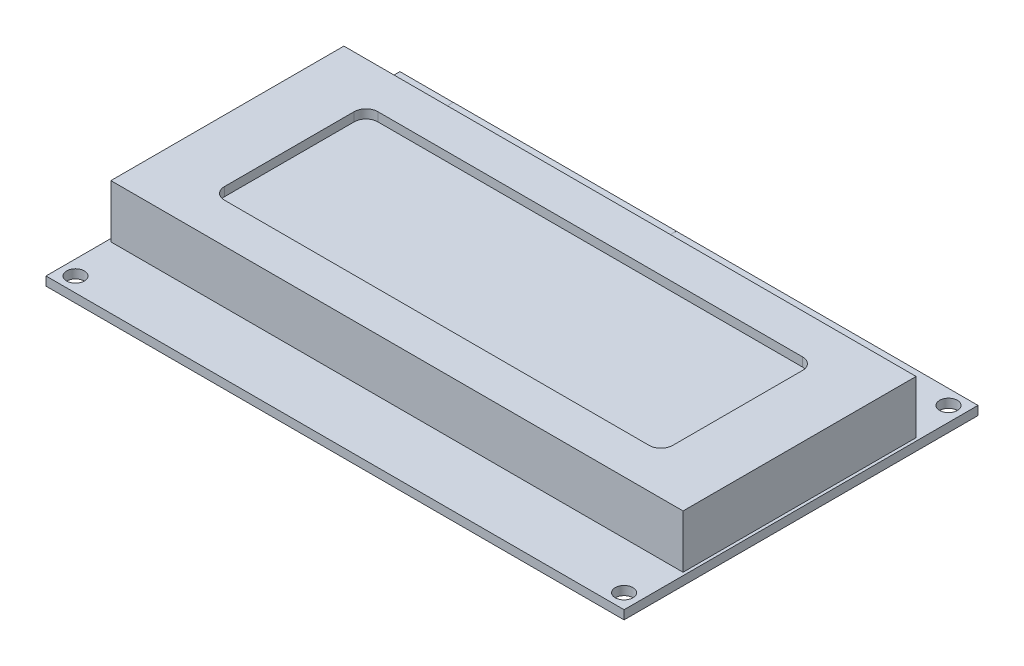
ISO-10303-21;
HEADER;
FILE_DESCRIPTION(('STEP AP214'),'2;1');
FILE_NAME('part.step','',(''),(''),'','','');
FILE_SCHEMA(('AUTOMOTIVE_DESIGN { 1 0 10303 214 1 1 1 1 }'));
ENDSEC;
DATA;
#1=APPLICATION_CONTEXT('core data for automotive mechanical design processes');
#2=APPLICATION_PROTOCOL_DEFINITION('international standard','automotive_design',2000,#1);
#3=PRODUCT_CONTEXT('',#1,'mechanical');
#4=PRODUCT('Part','Part','',(#3));
#5=PRODUCT_RELATED_PRODUCT_CATEGORY('part','',(#4));
#6=PRODUCT_DEFINITION_FORMATION('','',#4);
#7=PRODUCT_DEFINITION_CONTEXT('part definition',#1,'design');
#8=PRODUCT_DEFINITION('design','',#6,#7);
#9=PRODUCT_DEFINITION_SHAPE('','',#8);
#10=(LENGTH_UNIT() NAMED_UNIT(*) SI_UNIT(.MILLI.,.METRE.));
#11=(NAMED_UNIT(*) PLANE_ANGLE_UNIT() SI_UNIT($,.RADIAN.));
#12=(NAMED_UNIT(*) SI_UNIT($,.STERADIAN.) SOLID_ANGLE_UNIT());
#13=UNCERTAINTY_MEASURE_WITH_UNIT(LENGTH_MEASURE(1.E-05),#10,'distance_accuracy_value','');
#14=(GEOMETRIC_REPRESENTATION_CONTEXT(3) GLOBAL_UNCERTAINTY_ASSIGNED_CONTEXT((#13)) GLOBAL_UNIT_ASSIGNED_CONTEXT((#10,
#11,#12)) REPRESENTATION_CONTEXT('',''));
#15=CARTESIAN_POINT('',(0.,0.,0.));
#16=DIRECTION('',(0.,0.,1.));
#17=DIRECTION('',(1.,0.,0.));
#18=AXIS2_PLACEMENT_3D('',#15,#16,#17);
#19=CARTESIAN_POINT('',(0.,1.5,0.));
#20=DIRECTION('',(0.,1.,0.));
#21=DIRECTION('',(0.,0.,1.));
#22=AXIS2_PLACEMENT_3D('',#19,#20,#21);
#23=PLANE('',#22);
#24=DIRECTION('',(1.,0.,0.));
#25=VECTOR('',#24,1.);
#26=CARTESIAN_POINT('',(-48.5,1.5,19.5));
#27=LINE('',#26,#25);
#28=CARTESIAN_POINT('',(-48.5,1.5,19.5));
#29=VERTEX_POINT('',#28);
#30=CARTESIAN_POINT('',(48.5,1.5,19.5));
#31=VERTEX_POINT('',#30);
#32=EDGE_CURVE('E299',#29,#31,#27,.T.);
#33=ORIENTED_EDGE('',*,*,#32,.F.);
#34=DIRECTION('',(0.,0.,1.));
#35=VECTOR('',#34,1.);
#36=CARTESIAN_POINT('',(-48.5,1.5,-20.));
#37=LINE('',#36,#35);
#38=CARTESIAN_POINT('',(-48.5,1.5,-20.));
#39=VERTEX_POINT('',#38);
#40=EDGE_CURVE('E271',#39,#29,#37,.T.);
#41=ORIENTED_EDGE('',*,*,#40,.F.);
#42=DIRECTION('',(-1.,0.,0.));
#43=VECTOR('',#42,1.);
#44=CARTESIAN_POINT('',(-48.5,1.5,-20.));
#45=LINE('',#44,#43);
#46=CARTESIAN_POINT('',(48.5,1.5,-20.));
#47=VERTEX_POINT('',#46);
#48=EDGE_CURVE('E290',#47,#39,#45,.T.);
#49=ORIENTED_EDGE('',*,*,#48,.F.);
#50=DIRECTION('',(0.,0.,-1.));
#51=VECTOR('',#50,1.);
#52=CARTESIAN_POINT('',(48.5,1.5,-20.));
#53=LINE('',#52,#51);
#54=EDGE_CURVE('E301',#31,#47,#53,.T.);
#55=ORIENTED_EDGE('',*,*,#54,.F.);
#56=EDGE_LOOP('',(#33,#41,#49,#55));
#57=FACE_BOUND('',#56,.T.);
#58=CARTESIAN_POINT('',(-46.5,1.5,-27.5));
#59=DIRECTION('',(0.,1.,0.));
#60=DIRECTION('',(0.,0.,1.));
#61=AXIS2_PLACEMENT_3D('',#58,#59,#60);
#62=CIRCLE('',#61,1.5);
#63=CARTESIAN_POINT('',(-46.5,1.5,-26.));
#64=VERTEX_POINT('',#63);
#65=EDGE_CURVE('E215',#64,#64,#62,.T.);
#66=ORIENTED_EDGE('',*,*,#65,.F.);
#67=EDGE_LOOP('',(#66));
#68=FACE_BOUND('',#67,.T.);
#69=CARTESIAN_POINT('',(46.5,1.5,-27.5));
#70=DIRECTION('',(0.,1.,0.));
#71=DIRECTION('',(0.,0.,1.));
#72=AXIS2_PLACEMENT_3D('',#69,#70,#71);
#73=CIRCLE('',#72,1.5);
#74=CARTESIAN_POINT('',(46.5,1.5,-26.));
#75=VERTEX_POINT('',#74);
#76=EDGE_CURVE('E209',#75,#75,#73,.T.);
#77=ORIENTED_EDGE('',*,*,#76,.F.);
#78=EDGE_LOOP('',(#77));
#79=FACE_BOUND('',#78,.T.);
#80=CARTESIAN_POINT('',(46.5,1.5,27.5));
#81=DIRECTION('',(0.,1.,0.));
#82=DIRECTION('',(0.,0.,1.));
#83=AXIS2_PLACEMENT_3D('',#80,#81,#82);
#84=CIRCLE('',#83,1.5);
#85=CARTESIAN_POINT('',(46.5,1.5,29.));
#86=VERTEX_POINT('',#85);
#87=EDGE_CURVE('E203',#86,#86,#84,.T.);
#88=ORIENTED_EDGE('',*,*,#87,.F.);
#89=EDGE_LOOP('',(#88));
#90=FACE_BOUND('',#89,.T.);
#91=CARTESIAN_POINT('',(-46.5,1.5,27.5));
#92=DIRECTION('',(0.,1.,0.));
#93=DIRECTION('',(0.,0.,1.));
#94=AXIS2_PLACEMENT_3D('',#91,#92,#93);
#95=CIRCLE('',#94,1.5);
#96=CARTESIAN_POINT('',(-46.5,1.5,29.));
#97=VERTEX_POINT('',#96);
#98=EDGE_CURVE('E192',#97,#97,#95,.T.);
#99=ORIENTED_EDGE('',*,*,#98,.F.);
#100=EDGE_LOOP('',(#99));
#101=FACE_BOUND('',#100,.T.);
#102=DIRECTION('',(1.,0.,0.));
#103=VECTOR('',#102,1.);
#104=CARTESIAN_POINT('',(-39.9546214681868,1.5,-25.4744230837432));
#105=LINE('',#104,#103);
#106=CARTESIAN_POINT('',(-39.9546214681868,1.5,-25.4744230837432));
#107=VERTEX_POINT('',#106);
#108=CARTESIAN_POINT('',(-2.14521457547312,1.5,-25.4744230837432));
#109=VERTEX_POINT('',#108);
#110=EDGE_CURVE('E49',#107,#109,#105,.T.);
#111=ORIENTED_EDGE('',*,*,#110,.F.);
#112=DIRECTION('',(0.,0.,1.));
#113=VECTOR('',#112,1.);
#114=CARTESIAN_POINT('',(-39.9546214681868,1.5,-30.));
#115=LINE('',#114,#113);
#116=CARTESIAN_POINT('',(-39.9546214681868,1.5,-30.));
#117=VERTEX_POINT('',#116);
#118=EDGE_CURVE('E191',#117,#107,#115,.T.);
#119=ORIENTED_EDGE('',*,*,#118,.F.);
#120=DIRECTION('',(-1.,0.,0.));
#121=VECTOR('',#120,1.);
#122=CARTESIAN_POINT('',(-49.,1.5,-30.));
#123=LINE('',#122,#121);
#124=CARTESIAN_POINT('',(-49.,1.5,-30.));
#125=VERTEX_POINT('',#124);
#126=EDGE_CURVE('E323',#117,#125,#123,.T.);
#127=ORIENTED_EDGE('',*,*,#126,.T.);
#128=DIRECTION('',(0.,0.,1.));
#129=VECTOR('',#128,1.);
#130=CARTESIAN_POINT('',(-49.,1.5,-30.));
#131=LINE('',#130,#129);
#132=CARTESIAN_POINT('',(-49.,1.5,30.));
#133=VERTEX_POINT('',#132);
#134=EDGE_CURVE('E315',#125,#133,#131,.T.);
#135=ORIENTED_EDGE('',*,*,#134,.T.);
#136=DIRECTION('',(1.,0.,0.));
#137=VECTOR('',#136,1.);
#138=CARTESIAN_POINT('',(-49.,1.5,30.));
#139=LINE('',#138,#137);
#140=CARTESIAN_POINT('',(49.,1.5,30.));
#141=VERTEX_POINT('',#140);
#142=EDGE_CURVE('E318',#133,#141,#139,.T.);
#143=ORIENTED_EDGE('',*,*,#142,.T.);
#144=DIRECTION('',(0.,0.,-1.));
#145=VECTOR('',#144,1.);
#146=CARTESIAN_POINT('',(49.,1.5,-30.));
#147=LINE('',#146,#145);
#148=CARTESIAN_POINT('',(49.,1.5,-30.));
#149=VERTEX_POINT('',#148);
#150=EDGE_CURVE('E321',#141,#149,#147,.T.);
#151=ORIENTED_EDGE('',*,*,#150,.T.);
#152=CARTESIAN_POINT('',(-2.14521457547312,1.5,-30.));
#153=VERTEX_POINT('',#152);
#154=EDGE_CURVE('E324',#149,#153,#123,.T.);
#155=ORIENTED_EDGE('',*,*,#154,.T.);
#156=DIRECTION('',(0.,0.,-1.));
#157=VECTOR('',#156,1.);
#158=CARTESIAN_POINT('',(-2.14521457547312,1.5,-30.));
#159=LINE('',#158,#157);
#160=EDGE_CURVE('E54',#109,#153,#159,.T.);
#161=ORIENTED_EDGE('',*,*,#160,.F.);
#162=EDGE_LOOP('',(#111,#119,#127,#135,#143,#151,#155,#161));
#163=FACE_BOUND('',#162,.T.);
#164=ADVANCED_FACE('F34',(#57,#68,#79,#90,#101,#163),#23,.T.);
#165=CARTESIAN_POINT('',(-49.,1.5,-30.));
#166=DIRECTION('',(1.,0.,0.));
#167=DIRECTION('',(0.,0.,-1.));
#168=AXIS2_PLACEMENT_3D('',#165,#166,#167);
#169=PLANE('',#168);
#170=DIRECTION('',(0.,0.,1.));
#171=VECTOR('',#170,1.);
#172=CARTESIAN_POINT('',(-49.,0.,-30.));
#173=LINE('',#172,#171);
#174=CARTESIAN_POINT('',(-49.,0.,-30.));
#175=VERTEX_POINT('',#174);
#176=CARTESIAN_POINT('',(-49.,0.,30.));
#177=VERTEX_POINT('',#176);
#178=EDGE_CURVE('E314',#175,#177,#173,.T.);
#179=ORIENTED_EDGE('',*,*,#178,.T.);
#180=DIRECTION('',(0.,-1.,0.));
#181=VECTOR('',#180,1.);
#182=CARTESIAN_POINT('',(-49.,1.5,30.));
#183=LINE('',#182,#181);
#184=EDGE_CURVE('E11',#133,#177,#183,.T.);
#185=ORIENTED_EDGE('',*,*,#184,.F.);
#186=ORIENTED_EDGE('',*,*,#134,.F.);
#187=DIRECTION('',(0.,-1.,0.));
#188=VECTOR('',#187,1.);
#189=CARTESIAN_POINT('',(-49.,1.5,-30.));
#190=LINE('',#189,#188);
#191=EDGE_CURVE('E326',#125,#175,#190,.T.);
#192=ORIENTED_EDGE('',*,*,#191,.T.);
#193=EDGE_LOOP('',(#179,#185,#186,#192));
#194=FACE_BOUND('',#193,.T.);
#195=ADVANCED_FACE('F36',(#194),#169,.F.);
#196=CARTESIAN_POINT('',(-49.,1.5,30.));
#197=DIRECTION('',(0.,0.,-1.));
#198=DIRECTION('',(-1.,0.,0.));
#199=AXIS2_PLACEMENT_3D('',#196,#197,#198);
#200=PLANE('',#199);
#201=DIRECTION('',(1.,0.,0.));
#202=VECTOR('',#201,1.);
#203=CARTESIAN_POINT('',(-49.,0.,30.));
#204=LINE('',#203,#202);
#205=CARTESIAN_POINT('',(49.,0.,30.));
#206=VERTEX_POINT('',#205);
#207=EDGE_CURVE('E329',#177,#206,#204,.T.);
#208=ORIENTED_EDGE('',*,*,#207,.T.);
#209=DIRECTION('',(0.,-1.,0.));
#210=VECTOR('',#209,1.);
#211=CARTESIAN_POINT('',(49.,1.5,30.));
#212=LINE('',#211,#210);
#213=EDGE_CURVE('E42',#141,#206,#212,.T.);
#214=ORIENTED_EDGE('',*,*,#213,.F.);
#215=ORIENTED_EDGE('',*,*,#142,.F.);
#216=ORIENTED_EDGE('',*,*,#184,.T.);
#217=EDGE_LOOP('',(#208,#214,#215,#216));
#218=FACE_BOUND('',#217,.T.);
#219=ADVANCED_FACE('F382',(#218),#200,.F.);
#220=CARTESIAN_POINT('',(49.,1.5,-30.));
#221=DIRECTION('',(-1.,0.,0.));
#222=DIRECTION('',(0.,0.,1.));
#223=AXIS2_PLACEMENT_3D('',#220,#221,#222);
#224=PLANE('',#223);
#225=DIRECTION('',(0.,0.,-1.));
#226=VECTOR('',#225,1.);
#227=CARTESIAN_POINT('',(49.,0.,-30.));
#228=LINE('',#227,#226);
#229=CARTESIAN_POINT('',(49.,0.,-30.));
#230=VERTEX_POINT('',#229);
#231=EDGE_CURVE('E331',#206,#230,#228,.T.);
#232=ORIENTED_EDGE('',*,*,#231,.T.);
#233=DIRECTION('',(0.,-1.,0.));
#234=VECTOR('',#233,1.);
#235=CARTESIAN_POINT('',(49.,1.5,-30.));
#236=LINE('',#235,#234);
#237=EDGE_CURVE('E336',#149,#230,#236,.T.);
#238=ORIENTED_EDGE('',*,*,#237,.F.);
#239=ORIENTED_EDGE('',*,*,#150,.F.);
#240=ORIENTED_EDGE('',*,*,#213,.T.);
#241=EDGE_LOOP('',(#232,#238,#239,#240));
#242=FACE_BOUND('',#241,.T.);
#243=ADVANCED_FACE('F343',(#242),#224,.F.);
#244=CARTESIAN_POINT('',(-49.,1.5,-30.));
#245=DIRECTION('',(0.,0.,1.));
#246=DIRECTION('',(1.,0.,0.));
#247=AXIS2_PLACEMENT_3D('',#244,#245,#246);
#248=PLANE('',#247);
#249=DIRECTION('',(-1.,0.,0.));
#250=VECTOR('',#249,1.);
#251=CARTESIAN_POINT('',(-49.,0.,-30.));
#252=LINE('',#251,#250);
#253=EDGE_CURVE('E319',#230,#175,#252,.T.);
#254=ORIENTED_EDGE('',*,*,#253,.T.);
#255=ORIENTED_EDGE('',*,*,#191,.F.);
#256=ORIENTED_EDGE('',*,*,#126,.F.);
#257=DIRECTION('',(0.,-1.,0.));
#258=VECTOR('',#257,1.);
#259=CARTESIAN_POINT('',(-39.9546214681868,1.51,-30.));
#260=LINE('',#259,#258);
#261=CARTESIAN_POINT('',(-39.9546214681868,1.51,-30.));
#262=VERTEX_POINT('',#261);
#263=EDGE_CURVE('E357',#262,#117,#260,.T.);
#264=ORIENTED_EDGE('',*,*,#263,.F.);
#265=DIRECTION('',(-1.,0.,0.));
#266=VECTOR('',#265,1.);
#267=CARTESIAN_POINT('',(-39.9546214681868,1.51,-30.));
#268=LINE('',#267,#266);
#269=CARTESIAN_POINT('',(-2.14521457547312,1.51,-30.));
#270=VERTEX_POINT('',#269);
#271=EDGE_CURVE('E185',#270,#262,#268,.T.);
#272=ORIENTED_EDGE('',*,*,#271,.F.);
#273=DIRECTION('',(0.,-1.,0.));
#274=VECTOR('',#273,1.);
#275=CARTESIAN_POINT('',(-2.14521457547312,1.51,-30.));
#276=LINE('',#275,#274);
#277=EDGE_CURVE('E197',#270,#153,#276,.T.);
#278=ORIENTED_EDGE('',*,*,#277,.T.);
#279=ORIENTED_EDGE('',*,*,#154,.F.);
#280=ORIENTED_EDGE('',*,*,#237,.T.);
#281=EDGE_LOOP('',(#254,#255,#256,#264,#272,#278,#279,#280));
#282=FACE_BOUND('',#281,.T.);
#283=ADVANCED_FACE('F352',(#282),#248,.F.);
#284=CARTESIAN_POINT('',(0.,0.,0.));
#285=DIRECTION('',(0.,1.,0.));
#286=DIRECTION('',(0.,0.,1.));
#287=AXIS2_PLACEMENT_3D('',#284,#285,#286);
#288=PLANE('',#287);
#289=CARTESIAN_POINT('',(-46.5,0.,27.5));
#290=DIRECTION('',(0.,1.,0.));
#291=DIRECTION('',(0.,0.,1.));
#292=AXIS2_PLACEMENT_3D('',#289,#290,#291);
#293=CIRCLE('',#292,1.5);
#294=CARTESIAN_POINT('',(-46.5,0.,29.));
#295=VERTEX_POINT('',#294);
#296=EDGE_CURVE('E195',#295,#295,#293,.F.);
#297=ORIENTED_EDGE('',*,*,#296,.F.);
#298=EDGE_LOOP('',(#297));
#299=FACE_BOUND('',#298,.T.);
#300=CARTESIAN_POINT('',(46.5,0.,27.5));
#301=DIRECTION('',(0.,1.,0.));
#302=DIRECTION('',(0.,0.,1.));
#303=AXIS2_PLACEMENT_3D('',#300,#301,#302);
#304=CIRCLE('',#303,1.5);
#305=CARTESIAN_POINT('',(46.5,0.,29.));
#306=VERTEX_POINT('',#305);
#307=EDGE_CURVE('E206',#306,#306,#304,.F.);
#308=ORIENTED_EDGE('',*,*,#307,.F.);
#309=EDGE_LOOP('',(#308));
#310=FACE_BOUND('',#309,.T.);
#311=CARTESIAN_POINT('',(46.5,0.,-27.5));
#312=DIRECTION('',(0.,1.,0.));
#313=DIRECTION('',(0.,0.,1.));
#314=AXIS2_PLACEMENT_3D('',#311,#312,#313);
#315=CIRCLE('',#314,1.5);
#316=CARTESIAN_POINT('',(46.5,0.,-26.));
#317=VERTEX_POINT('',#316);
#318=EDGE_CURVE('E212',#317,#317,#315,.F.);
#319=ORIENTED_EDGE('',*,*,#318,.F.);
#320=EDGE_LOOP('',(#319));
#321=FACE_BOUND('',#320,.T.);
#322=CARTESIAN_POINT('',(-46.5,0.,-27.5));
#323=DIRECTION('',(0.,1.,0.));
#324=DIRECTION('',(0.,0.,1.));
#325=AXIS2_PLACEMENT_3D('',#322,#323,#324);
#326=CIRCLE('',#325,1.5);
#327=CARTESIAN_POINT('',(-46.5,0.,-26.));
#328=VERTEX_POINT('',#327);
#329=EDGE_CURVE('E218',#328,#328,#326,.F.);
#330=ORIENTED_EDGE('',*,*,#329,.F.);
#331=EDGE_LOOP('',(#330));
#332=FACE_BOUND('',#331,.T.);
#333=ORIENTED_EDGE('',*,*,#178,.F.);
#334=ORIENTED_EDGE('',*,*,#253,.F.);
#335=ORIENTED_EDGE('',*,*,#231,.F.);
#336=ORIENTED_EDGE('',*,*,#207,.F.);
#337=EDGE_LOOP('',(#333,#334,#335,#336));
#338=FACE_BOUND('',#337,.T.);
#339=ADVANCED_FACE('F349',(#299,#310,#321,#332,#338),#288,.F.);
#340=CARTESIAN_POINT('',(-48.5,10.5,-20.));
#341=DIRECTION('',(1.,0.,0.));
#342=DIRECTION('',(0.,0.,-1.));
#343=AXIS2_PLACEMENT_3D('',#340,#341,#342);
#344=PLANE('',#343);
#345=ORIENTED_EDGE('',*,*,#40,.T.);
#346=DIRECTION('',(0.,-1.,0.));
#347=VECTOR('',#346,1.);
#348=CARTESIAN_POINT('',(-48.5,10.5,19.5));
#349=LINE('',#348,#347);
#350=CARTESIAN_POINT('',(-48.5,10.5,19.5));
#351=VERTEX_POINT('',#350);
#352=EDGE_CURVE('E312',#351,#29,#349,.T.);
#353=ORIENTED_EDGE('',*,*,#352,.F.);
#354=DIRECTION('',(0.,0.,1.));
#355=VECTOR('',#354,1.);
#356=CARTESIAN_POINT('',(-48.5,10.5,-20.));
#357=LINE('',#356,#355);
#358=CARTESIAN_POINT('',(-48.5,10.5,-20.));
#359=VERTEX_POINT('',#358);
#360=EDGE_CURVE('E286',#359,#351,#357,.T.);
#361=ORIENTED_EDGE('',*,*,#360,.F.);
#362=DIRECTION('',(0.,-1.,0.));
#363=VECTOR('',#362,1.);
#364=CARTESIAN_POINT('',(-48.5,10.5,-20.));
#365=LINE('',#364,#363);
#366=EDGE_CURVE('E296',#359,#39,#365,.T.);
#367=ORIENTED_EDGE('',*,*,#366,.T.);
#368=EDGE_LOOP('',(#345,#353,#361,#367));
#369=FACE_BOUND('',#368,.T.);
#370=ADVANCED_FACE('F387',(#369),#344,.F.);
#371=CARTESIAN_POINT('',(-48.5,10.5,19.5));
#372=DIRECTION('',(0.,0.,-1.));
#373=DIRECTION('',(-1.,0.,0.));
#374=AXIS2_PLACEMENT_3D('',#371,#372,#373);
#375=PLANE('',#374);
#376=ORIENTED_EDGE('',*,*,#32,.T.);
#377=DIRECTION('',(0.,-1.,0.));
#378=VECTOR('',#377,1.);
#379=CARTESIAN_POINT('',(48.5,10.5,19.5));
#380=LINE('',#379,#378);
#381=CARTESIAN_POINT('',(48.5,10.5,19.5));
#382=VERTEX_POINT('',#381);
#383=EDGE_CURVE('E309',#382,#31,#380,.T.);
#384=ORIENTED_EDGE('',*,*,#383,.F.);
#385=DIRECTION('',(1.,0.,0.));
#386=VECTOR('',#385,1.);
#387=CARTESIAN_POINT('',(-48.5,10.5,19.5));
#388=LINE('',#387,#386);
#389=EDGE_CURVE('E289',#351,#382,#388,.T.);
#390=ORIENTED_EDGE('',*,*,#389,.F.);
#391=ORIENTED_EDGE('',*,*,#352,.T.);
#392=EDGE_LOOP('',(#376,#384,#390,#391));
#393=FACE_BOUND('',#392,.T.);
#394=ADVANCED_FACE('F421',(#393),#375,.F.);
#395=CARTESIAN_POINT('',(48.5,10.5,-20.));
#396=DIRECTION('',(-1.,0.,0.));
#397=DIRECTION('',(0.,0.,1.));
#398=AXIS2_PLACEMENT_3D('',#395,#396,#397);
#399=PLANE('',#398);
#400=ORIENTED_EDGE('',*,*,#54,.T.);
#401=DIRECTION('',(0.,-1.,0.));
#402=VECTOR('',#401,1.);
#403=CARTESIAN_POINT('',(48.5,10.5,-20.));
#404=LINE('',#403,#402);
#405=CARTESIAN_POINT('',(48.5,10.5,-20.));
#406=VERTEX_POINT('',#405);
#407=EDGE_CURVE('E307',#406,#47,#404,.T.);
#408=ORIENTED_EDGE('',*,*,#407,.F.);
#409=DIRECTION('',(0.,0.,-1.));
#410=VECTOR('',#409,1.);
#411=CARTESIAN_POINT('',(48.5,10.5,-20.));
#412=LINE('',#411,#410);
#413=EDGE_CURVE('E292',#382,#406,#412,.T.);
#414=ORIENTED_EDGE('',*,*,#413,.F.);
#415=ORIENTED_EDGE('',*,*,#383,.T.);
#416=EDGE_LOOP('',(#400,#408,#414,#415));
#417=FACE_BOUND('',#416,.T.);
#418=ADVANCED_FACE('F428',(#417),#399,.F.);
#419=CARTESIAN_POINT('',(-48.5,10.5,-20.));
#420=DIRECTION('',(0.,0.,1.));
#421=DIRECTION('',(1.,0.,0.));
#422=AXIS2_PLACEMENT_3D('',#419,#420,#421);
#423=PLANE('',#422);
#424=ORIENTED_EDGE('',*,*,#48,.T.);
#425=ORIENTED_EDGE('',*,*,#366,.F.);
#426=DIRECTION('',(-1.,0.,0.));
#427=VECTOR('',#426,1.);
#428=CARTESIAN_POINT('',(-48.5,10.5,-20.));
#429=LINE('',#428,#427);
#430=EDGE_CURVE('E294',#406,#359,#429,.T.);
#431=ORIENTED_EDGE('',*,*,#430,.F.);
#432=ORIENTED_EDGE('',*,*,#407,.T.);
#433=EDGE_LOOP('',(#424,#425,#431,#432));
#434=FACE_BOUND('',#433,.T.);
#435=ADVANCED_FACE('F435',(#434),#423,.F.);
#436=CARTESIAN_POINT('',(0.,10.5,0.));
#437=DIRECTION('',(0.,1.,0.));
#438=DIRECTION('',(0.,0.,1.));
#439=AXIS2_PLACEMENT_3D('',#436,#437,#438);
#440=PLANE('',#439);
#441=CARTESIAN_POINT('',(36.,10.5,-11.25));
#442=DIRECTION('',(0.,1.,0.));
#443=DIRECTION('',(0.,0.,-1.));
#444=AXIS2_PLACEMENT_3D('',#441,#442,#443);
#445=CIRCLE('',#444,2.);
#446=CARTESIAN_POINT('',(38.,10.5,-11.25));
#447=VERTEX_POINT('',#446);
#448=CARTESIAN_POINT('',(36.,10.5,-13.25));
#449=VERTEX_POINT('',#448);
#450=EDGE_CURVE('E221',#447,#449,#445,.T.);
#451=ORIENTED_EDGE('',*,*,#450,.F.);
#452=DIRECTION('',(0.,0.,-1.));
#453=VECTOR('',#452,1.);
#454=CARTESIAN_POINT('',(38.,10.5,-11.25));
#455=LINE('',#454,#453);
#456=CARTESIAN_POINT('',(38.,10.5,10.75));
#457=VERTEX_POINT('',#456);
#458=EDGE_CURVE('E226',#457,#447,#455,.T.);
#459=ORIENTED_EDGE('',*,*,#458,.F.);
#460=CARTESIAN_POINT('',(36.,10.5,10.75));
#461=DIRECTION('',(0.,1.,0.));
#462=DIRECTION('',(0.,0.,1.));
#463=AXIS2_PLACEMENT_3D('',#460,#461,#462);
#464=CIRCLE('',#463,2.);
#465=CARTESIAN_POINT('',(36.,10.5,12.75));
#466=VERTEX_POINT('',#465);
#467=EDGE_CURVE('E264',#466,#457,#464,.T.);
#468=ORIENTED_EDGE('',*,*,#467,.F.);
#469=DIRECTION('',(1.,0.,0.));
#470=VECTOR('',#469,1.);
#471=CARTESIAN_POINT('',(-36.,10.5,12.75));
#472=LINE('',#471,#470);
#473=CARTESIAN_POINT('',(-36.,10.5,12.75));
#474=VERTEX_POINT('',#473);
#475=EDGE_CURVE('E261',#474,#466,#472,.T.);
#476=ORIENTED_EDGE('',*,*,#475,.F.);
#477=CARTESIAN_POINT('',(-36.,10.5,10.75));
#478=DIRECTION('',(0.,1.,0.));
#479=DIRECTION('',(0.,0.,1.));
#480=AXIS2_PLACEMENT_3D('',#477,#478,#479);
#481=CIRCLE('',#480,2.);
#482=CARTESIAN_POINT('',(-38.,10.5,10.75));
#483=VERTEX_POINT('',#482);
#484=EDGE_CURVE('E258',#483,#474,#481,.T.);
#485=ORIENTED_EDGE('',*,*,#484,.F.);
#486=DIRECTION('',(0.,0.,1.));
#487=VECTOR('',#486,1.);
#488=CARTESIAN_POINT('',(-38.,10.5,-11.25));
#489=LINE('',#488,#487);
#490=CARTESIAN_POINT('',(-38.,10.5,-11.25));
#491=VERTEX_POINT('',#490);
#492=EDGE_CURVE('E255',#491,#483,#489,.T.);
#493=ORIENTED_EDGE('',*,*,#492,.F.);
#494=CARTESIAN_POINT('',(-36.,10.5,-11.25));
#495=DIRECTION('',(0.,1.,0.));
#496=DIRECTION('',(0.,0.,1.));
#497=AXIS2_PLACEMENT_3D('',#494,#495,#496);
#498=CIRCLE('',#497,2.);
#499=CARTESIAN_POINT('',(-36.,10.5,-13.25));
#500=VERTEX_POINT('',#499);
#501=EDGE_CURVE('E252',#500,#491,#498,.T.);
#502=ORIENTED_EDGE('',*,*,#501,.F.);
#503=DIRECTION('',(-1.,0.,0.));
#504=VECTOR('',#503,1.);
#505=CARTESIAN_POINT('',(-36.,10.5,-13.25));
#506=LINE('',#505,#504);
#507=EDGE_CURVE('E249',#449,#500,#506,.T.);
#508=ORIENTED_EDGE('',*,*,#507,.F.);
#509=EDGE_LOOP('',(#451,#459,#468,#476,#485,#493,#502,#508));
#510=FACE_BOUND('',#509,.T.);
#511=ORIENTED_EDGE('',*,*,#360,.T.);
#512=ORIENTED_EDGE('',*,*,#389,.T.);
#513=ORIENTED_EDGE('',*,*,#413,.T.);
#514=ORIENTED_EDGE('',*,*,#430,.T.);
#515=EDGE_LOOP('',(#511,#512,#513,#514));
#516=FACE_BOUND('',#515,.T.);
#517=ADVANCED_FACE('F443',(#510,#516),#440,.T.);
#518=CARTESIAN_POINT('',(36.,9.,-11.25));
#519=DIRECTION('',(0.,1.,0.));
#520=DIRECTION('',(0.,0.,1.));
#521=AXIS2_PLACEMENT_3D('',#518,#519,#520);
#522=CYLINDRICAL_SURFACE('',#521,2.);
#523=ORIENTED_EDGE('',*,*,#450,.T.);
#524=DIRECTION('',(0.,1.,0.));
#525=VECTOR('',#524,1.);
#526=CARTESIAN_POINT('',(36.,9.,-13.25));
#527=LINE('',#526,#525);
#528=CARTESIAN_POINT('',(36.,9.,-13.25));
#529=VERTEX_POINT('',#528);
#530=EDGE_CURVE('E247',#529,#449,#527,.T.);
#531=ORIENTED_EDGE('',*,*,#530,.F.);
#532=CARTESIAN_POINT('',(36.,9.,-11.25));
#533=DIRECTION('',(0.,1.,0.));
#534=DIRECTION('',(0.,0.,-1.));
#535=AXIS2_PLACEMENT_3D('',#532,#533,#534);
#536=CIRCLE('',#535,2.);
#537=CARTESIAN_POINT('',(38.,9.,-11.25));
#538=VERTEX_POINT('',#537);
#539=EDGE_CURVE('E222',#538,#529,#536,.T.);
#540=ORIENTED_EDGE('',*,*,#539,.F.);
#541=DIRECTION('',(0.,1.,0.));
#542=VECTOR('',#541,1.);
#543=CARTESIAN_POINT('',(38.,9.,-11.25));
#544=LINE('',#543,#542);
#545=EDGE_CURVE('E269',#538,#447,#544,.T.);
#546=ORIENTED_EDGE('',*,*,#545,.T.);
#547=EDGE_LOOP('',(#523,#531,#540,#546));
#548=FACE_BOUND('',#547,.T.);
#549=ADVANCED_FACE('F451',(#548),#522,.F.);
#550=CARTESIAN_POINT('',(38.,9.,-11.25));
#551=DIRECTION('',(1.,0.,0.));
#552=DIRECTION('',(0.,0.,-1.));
#553=AXIS2_PLACEMENT_3D('',#550,#551,#552);
#554=PLANE('',#553);
#555=ORIENTED_EDGE('',*,*,#458,.T.);
#556=ORIENTED_EDGE('',*,*,#545,.F.);
#557=DIRECTION('',(0.,0.,-1.));
#558=VECTOR('',#557,1.);
#559=CARTESIAN_POINT('',(38.,9.,-11.25));
#560=LINE('',#559,#558);
#561=CARTESIAN_POINT('',(38.,9.,10.75));
#562=VERTEX_POINT('',#561);
#563=EDGE_CURVE('E244',#562,#538,#560,.T.);
#564=ORIENTED_EDGE('',*,*,#563,.F.);
#565=DIRECTION('',(0.,1.,0.));
#566=VECTOR('',#565,1.);
#567=CARTESIAN_POINT('',(38.,9.,10.75));
#568=LINE('',#567,#566);
#569=EDGE_CURVE('E272',#562,#457,#568,.T.);
#570=ORIENTED_EDGE('',*,*,#569,.T.);
#571=EDGE_LOOP('',(#555,#556,#564,#570));
#572=FACE_BOUND('',#571,.T.);
#573=ADVANCED_FACE('F459',(#572),#554,.F.);
#574=CARTESIAN_POINT('',(36.,9.,10.75));
#575=DIRECTION('',(0.,1.,0.));
#576=DIRECTION('',(0.,0.,1.));
#577=AXIS2_PLACEMENT_3D('',#574,#575,#576);
#578=CYLINDRICAL_SURFACE('',#577,2.);
#579=ORIENTED_EDGE('',*,*,#467,.T.);
#580=ORIENTED_EDGE('',*,*,#569,.F.);
#581=CARTESIAN_POINT('',(36.,9.,10.75));
#582=DIRECTION('',(0.,1.,0.));
#583=DIRECTION('',(0.,0.,1.));
#584=AXIS2_PLACEMENT_3D('',#581,#582,#583);
#585=CIRCLE('',#584,2.);
#586=CARTESIAN_POINT('',(36.,9.,12.75));
#587=VERTEX_POINT('',#586);
#588=EDGE_CURVE('E241',#587,#562,#585,.T.);
#589=ORIENTED_EDGE('',*,*,#588,.F.);
#590=DIRECTION('',(0.,1.,0.));
#591=VECTOR('',#590,1.);
#592=CARTESIAN_POINT('',(36.,9.,12.75));
#593=LINE('',#592,#591);
#594=EDGE_CURVE('E274',#587,#466,#593,.T.);
#595=ORIENTED_EDGE('',*,*,#594,.T.);
#596=EDGE_LOOP('',(#579,#580,#589,#595));
#597=FACE_BOUND('',#596,.T.);
#598=ADVANCED_FACE('F467',(#597),#578,.F.);
#599=CARTESIAN_POINT('',(-36.,9.,12.75));
#600=DIRECTION('',(0.,0.,1.));
#601=DIRECTION('',(1.,0.,0.));
#602=AXIS2_PLACEMENT_3D('',#599,#600,#601);
#603=PLANE('',#602);
#604=ORIENTED_EDGE('',*,*,#475,.T.);
#605=ORIENTED_EDGE('',*,*,#594,.F.);
#606=DIRECTION('',(1.,0.,0.));
#607=VECTOR('',#606,1.);
#608=CARTESIAN_POINT('',(-36.,9.,12.75));
#609=LINE('',#608,#607);
#610=CARTESIAN_POINT('',(-36.,9.,12.75));
#611=VERTEX_POINT('',#610);
#612=EDGE_CURVE('E238',#611,#587,#609,.T.);
#613=ORIENTED_EDGE('',*,*,#612,.F.);
#614=DIRECTION('',(0.,1.,0.));
#615=VECTOR('',#614,1.);
#616=CARTESIAN_POINT('',(-36.,9.,12.75));
#617=LINE('',#616,#615);
#618=EDGE_CURVE('E276',#611,#474,#617,.T.);
#619=ORIENTED_EDGE('',*,*,#618,.T.);
#620=EDGE_LOOP('',(#604,#605,#613,#619));
#621=FACE_BOUND('',#620,.T.);
#622=ADVANCED_FACE('F475',(#621),#603,.F.);
#623=CARTESIAN_POINT('',(-36.,9.,10.75));
#624=DIRECTION('',(0.,1.,0.));
#625=DIRECTION('',(0.,0.,1.));
#626=AXIS2_PLACEMENT_3D('',#623,#624,#625);
#627=CYLINDRICAL_SURFACE('',#626,2.);
#628=ORIENTED_EDGE('',*,*,#484,.T.);
#629=ORIENTED_EDGE('',*,*,#618,.F.);
#630=CARTESIAN_POINT('',(-36.,9.,10.75));
#631=DIRECTION('',(0.,1.,0.));
#632=DIRECTION('',(0.,0.,1.));
#633=AXIS2_PLACEMENT_3D('',#630,#631,#632);
#634=CIRCLE('',#633,2.);
#635=CARTESIAN_POINT('',(-38.,9.,10.75));
#636=VERTEX_POINT('',#635);
#637=EDGE_CURVE('E235',#636,#611,#634,.T.);
#638=ORIENTED_EDGE('',*,*,#637,.F.);
#639=DIRECTION('',(0.,1.,0.));
#640=VECTOR('',#639,1.);
#641=CARTESIAN_POINT('',(-38.,9.,10.75));
#642=LINE('',#641,#640);
#643=EDGE_CURVE('E278',#636,#483,#642,.T.);
#644=ORIENTED_EDGE('',*,*,#643,.T.);
#645=EDGE_LOOP('',(#628,#629,#638,#644));
#646=FACE_BOUND('',#645,.T.);
#647=ADVANCED_FACE('F483',(#646),#627,.F.);
#648=CARTESIAN_POINT('',(-38.,9.,-11.25));
#649=DIRECTION('',(-1.,0.,0.));
#650=DIRECTION('',(0.,0.,1.));
#651=AXIS2_PLACEMENT_3D('',#648,#649,#650);
#652=PLANE('',#651);
#653=ORIENTED_EDGE('',*,*,#492,.T.);
#654=ORIENTED_EDGE('',*,*,#643,.F.);
#655=DIRECTION('',(0.,0.,1.));
#656=VECTOR('',#655,1.);
#657=CARTESIAN_POINT('',(-38.,9.,-11.25));
#658=LINE('',#657,#656);
#659=CARTESIAN_POINT('',(-38.,9.,-11.25));
#660=VERTEX_POINT('',#659);
#661=EDGE_CURVE('E232',#660,#636,#658,.T.);
#662=ORIENTED_EDGE('',*,*,#661,.F.);
#663=DIRECTION('',(0.,1.,0.));
#664=VECTOR('',#663,1.);
#665=CARTESIAN_POINT('',(-38.,9.,-11.25));
#666=LINE('',#665,#664);
#667=EDGE_CURVE('E280',#660,#491,#666,.T.);
#668=ORIENTED_EDGE('',*,*,#667,.T.);
#669=EDGE_LOOP('',(#653,#654,#662,#668));
#670=FACE_BOUND('',#669,.T.);
#671=ADVANCED_FACE('F491',(#670),#652,.F.);
#672=CARTESIAN_POINT('',(-36.,9.,-11.25));
#673=DIRECTION('',(0.,1.,0.));
#674=DIRECTION('',(0.,0.,1.));
#675=AXIS2_PLACEMENT_3D('',#672,#673,#674);
#676=CYLINDRICAL_SURFACE('',#675,2.);
#677=ORIENTED_EDGE('',*,*,#501,.T.);
#678=ORIENTED_EDGE('',*,*,#667,.F.);
#679=CARTESIAN_POINT('',(-36.,9.,-11.25));
#680=DIRECTION('',(0.,1.,0.));
#681=DIRECTION('',(0.,0.,1.));
#682=AXIS2_PLACEMENT_3D('',#679,#680,#681);
#683=CIRCLE('',#682,2.);
#684=CARTESIAN_POINT('',(-36.,9.,-13.25));
#685=VERTEX_POINT('',#684);
#686=EDGE_CURVE('E229',#685,#660,#683,.T.);
#687=ORIENTED_EDGE('',*,*,#686,.F.);
#688=DIRECTION('',(0.,1.,0.));
#689=VECTOR('',#688,1.);
#690=CARTESIAN_POINT('',(-36.,9.,-13.25));
#691=LINE('',#690,#689);
#692=EDGE_CURVE('E282',#685,#500,#691,.T.);
#693=ORIENTED_EDGE('',*,*,#692,.T.);
#694=EDGE_LOOP('',(#677,#678,#687,#693));
#695=FACE_BOUND('',#694,.T.);
#696=ADVANCED_FACE('F499',(#695),#676,.F.);
#697=CARTESIAN_POINT('',(-36.,9.,-13.25));
#698=DIRECTION('',(0.,0.,-1.));
#699=DIRECTION('',(-1.,0.,0.));
#700=AXIS2_PLACEMENT_3D('',#697,#698,#699);
#701=PLANE('',#700);
#702=ORIENTED_EDGE('',*,*,#507,.T.);
#703=ORIENTED_EDGE('',*,*,#692,.F.);
#704=DIRECTION('',(-1.,0.,0.));
#705=VECTOR('',#704,1.);
#706=CARTESIAN_POINT('',(-36.,9.,-13.25));
#707=LINE('',#706,#705);
#708=EDGE_CURVE('E225',#529,#685,#707,.T.);
#709=ORIENTED_EDGE('',*,*,#708,.F.);
#710=ORIENTED_EDGE('',*,*,#530,.T.);
#711=EDGE_LOOP('',(#702,#703,#709,#710));
#712=FACE_BOUND('',#711,.T.);
#713=ADVANCED_FACE('F507',(#712),#701,.F.);
#714=CARTESIAN_POINT('',(36.,9.,-11.25));
#715=DIRECTION('',(0.,-1.,0.));
#716=DIRECTION('',(0.,0.,-1.));
#717=AXIS2_PLACEMENT_3D('',#714,#715,#716);
#718=PLANE('',#717);
#719=ORIENTED_EDGE('',*,*,#539,.T.);
#720=ORIENTED_EDGE('',*,*,#708,.T.);
#721=ORIENTED_EDGE('',*,*,#686,.T.);
#722=ORIENTED_EDGE('',*,*,#661,.T.);
#723=ORIENTED_EDGE('',*,*,#637,.T.);
#724=ORIENTED_EDGE('',*,*,#612,.T.);
#725=ORIENTED_EDGE('',*,*,#588,.T.);
#726=ORIENTED_EDGE('',*,*,#563,.T.);
#727=EDGE_LOOP('',(#719,#720,#721,#722,#723,#724,#725,#726));
#728=FACE_BOUND('',#727,.T.);
#729=ADVANCED_FACE('F515',(#728),#718,.F.);
#730=CARTESIAN_POINT('',(-46.5,-0.000999999999999916,-27.5));
#731=DIRECTION('',(0.,1.,0.));
#732=DIRECTION('',(0.,0.,1.));
#733=AXIS2_PLACEMENT_3D('',#730,#731,#732);
#734=CYLINDRICAL_SURFACE('',#733,1.5);
#735=ORIENTED_EDGE('',*,*,#65,.T.);
#736=EDGE_LOOP('',(#735));
#737=FACE_BOUND('',#736,.T.);
#738=ORIENTED_EDGE('',*,*,#329,.T.);
#739=EDGE_LOOP('',(#738));
#740=FACE_BOUND('',#739,.T.);
#741=ADVANCED_FACE('F523',(#737,#740),#734,.F.);
#742=CARTESIAN_POINT('',(46.5,-0.000999999999999916,-27.5));
#743=DIRECTION('',(0.,1.,0.));
#744=DIRECTION('',(0.,0.,1.));
#745=AXIS2_PLACEMENT_3D('',#742,#743,#744);
#746=CYLINDRICAL_SURFACE('',#745,1.5);
#747=ORIENTED_EDGE('',*,*,#76,.T.);
#748=EDGE_LOOP('',(#747));
#749=FACE_BOUND('',#748,.T.);
#750=ORIENTED_EDGE('',*,*,#318,.T.);
#751=EDGE_LOOP('',(#750));
#752=FACE_BOUND('',#751,.T.);
#753=ADVANCED_FACE('F529',(#749,#752),#746,.F.);
#754=CARTESIAN_POINT('',(46.5,-0.000999999999999916,27.5));
#755=DIRECTION('',(0.,1.,0.));
#756=DIRECTION('',(0.,0.,1.));
#757=AXIS2_PLACEMENT_3D('',#754,#755,#756);
#758=CYLINDRICAL_SURFACE('',#757,1.5);
#759=ORIENTED_EDGE('',*,*,#87,.T.);
#760=EDGE_LOOP('',(#759));
#761=FACE_BOUND('',#760,.T.);
#762=ORIENTED_EDGE('',*,*,#307,.T.);
#763=EDGE_LOOP('',(#762));
#764=FACE_BOUND('',#763,.T.);
#765=ADVANCED_FACE('F537',(#761,#764),#758,.F.);
#766=CARTESIAN_POINT('',(-46.5,-0.000999999999999916,27.5));
#767=DIRECTION('',(0.,1.,0.));
#768=DIRECTION('',(0.,0.,1.));
#769=AXIS2_PLACEMENT_3D('',#766,#767,#768);
#770=CYLINDRICAL_SURFACE('',#769,1.5);
#771=ORIENTED_EDGE('',*,*,#98,.T.);
#772=EDGE_LOOP('',(#771));
#773=FACE_BOUND('',#772,.T.);
#774=ORIENTED_EDGE('',*,*,#296,.T.);
#775=EDGE_LOOP('',(#774));
#776=FACE_BOUND('',#775,.T.);
#777=ADVANCED_FACE('F545',(#773,#776),#770,.F.);
#778=CARTESIAN_POINT('',(-39.9546214681868,1.51,-30.));
#779=DIRECTION('',(1.,0.,0.));
#780=DIRECTION('',(0.,0.,-1.));
#781=AXIS2_PLACEMENT_3D('',#778,#779,#780);
#782=PLANE('',#781);
#783=ORIENTED_EDGE('',*,*,#118,.T.);
#784=DIRECTION('',(0.,-1.,0.));
#785=VECTOR('',#784,1.);
#786=CARTESIAN_POINT('',(-39.9546214681868,1.51,-25.4744230837432));
#787=LINE('',#786,#785);
#788=CARTESIAN_POINT('',(-39.9546214681868,1.51,-25.4744230837432));
#789=VERTEX_POINT('',#788);
#790=EDGE_CURVE('E173',#789,#107,#787,.T.);
#791=ORIENTED_EDGE('',*,*,#790,.F.);
#792=DIRECTION('',(0.,0.,1.));
#793=VECTOR('',#792,1.);
#794=CARTESIAN_POINT('',(-39.9546214681868,1.51,-30.));
#795=LINE('',#794,#793);
#796=EDGE_CURVE('E180',#262,#789,#795,.T.);
#797=ORIENTED_EDGE('',*,*,#796,.F.);
#798=ORIENTED_EDGE('',*,*,#263,.T.);
#799=EDGE_LOOP('',(#783,#791,#797,#798));
#800=FACE_BOUND('',#799,.T.);
#801=ADVANCED_FACE('F190',(#800),#782,.F.);
#802=CARTESIAN_POINT('',(-39.9546214681868,1.51,-25.4744230837432));
#803=DIRECTION('',(0.,0.,-1.));
#804=DIRECTION('',(-1.,0.,0.));
#805=AXIS2_PLACEMENT_3D('',#802,#803,#804);
#806=PLANE('',#805);
#807=ORIENTED_EDGE('',*,*,#110,.T.);
#808=DIRECTION('',(0.,-1.,0.));
#809=VECTOR('',#808,1.);
#810=CARTESIAN_POINT('',(-2.14521457547312,1.51,-25.4744230837432));
#811=LINE('',#810,#809);
#812=CARTESIAN_POINT('',(-2.14521457547312,1.51,-25.4744230837432));
#813=VERTEX_POINT('',#812);
#814=EDGE_CURVE('E176',#813,#109,#811,.T.);
#815=ORIENTED_EDGE('',*,*,#814,.F.);
#816=DIRECTION('',(1.,0.,0.));
#817=VECTOR('',#816,1.);
#818=CARTESIAN_POINT('',(-39.9546214681868,1.51,-25.4744230837432));
#819=LINE('',#818,#817);
#820=EDGE_CURVE('E169',#789,#813,#819,.T.);
#821=ORIENTED_EDGE('',*,*,#820,.F.);
#822=ORIENTED_EDGE('',*,*,#790,.T.);
#823=EDGE_LOOP('',(#807,#815,#821,#822));
#824=FACE_BOUND('',#823,.T.);
#825=ADVANCED_FACE('F171',(#824),#806,.F.);
#826=CARTESIAN_POINT('',(-2.14521457547312,1.51,-30.));
#827=DIRECTION('',(-1.,0.,0.));
#828=DIRECTION('',(0.,0.,1.));
#829=AXIS2_PLACEMENT_3D('',#826,#827,#828);
#830=PLANE('',#829);
#831=ORIENTED_EDGE('',*,*,#160,.T.);
#832=ORIENTED_EDGE('',*,*,#277,.F.);
#833=DIRECTION('',(0.,0.,-1.));
#834=VECTOR('',#833,1.);
#835=CARTESIAN_POINT('',(-2.14521457547312,1.51,-30.));
#836=LINE('',#835,#834);
#837=EDGE_CURVE('E179',#813,#270,#836,.T.);
#838=ORIENTED_EDGE('',*,*,#837,.F.);
#839=ORIENTED_EDGE('',*,*,#814,.T.);
#840=EDGE_LOOP('',(#831,#832,#838,#839));
#841=FACE_BOUND('',#840,.T.);
#842=ADVANCED_FACE('F367',(#841),#830,.F.);
#843=CARTESIAN_POINT('',(0.,1.51,0.));
#844=DIRECTION('',(0.,1.,0.));
#845=DIRECTION('',(0.,0.,1.));
#846=AXIS2_PLACEMENT_3D('',#843,#844,#845);
#847=PLANE('',#846);
#848=ORIENTED_EDGE('',*,*,#796,.T.);
#849=ORIENTED_EDGE('',*,*,#820,.T.);
#850=ORIENTED_EDGE('',*,*,#837,.T.);
#851=ORIENTED_EDGE('',*,*,#271,.T.);
#852=EDGE_LOOP('',(#848,#849,#850,#851));
#853=FACE_BOUND('',#852,.T.);
#854=ADVANCED_FACE('F183',(#853),#847,.T.);
#855=CLOSED_SHELL('',(#164,#195,#219,#243,#283,#339,#370,#394,#418,#435,#517,#549,#573,#598,
#622,#647,#671,#696,#713,#729,#741,#753,#765,#777,#801,#825,#842,#854));
#856=MANIFOLD_SOLID_BREP('B2',#855);
#857=ADVANCED_BREP_SHAPE_REPRESENTATION('',(#18,#856),#14);
#858=SHAPE_DEFINITION_REPRESENTATION(#9,#857);
ENDSEC;
END-ISO-10303-21;
